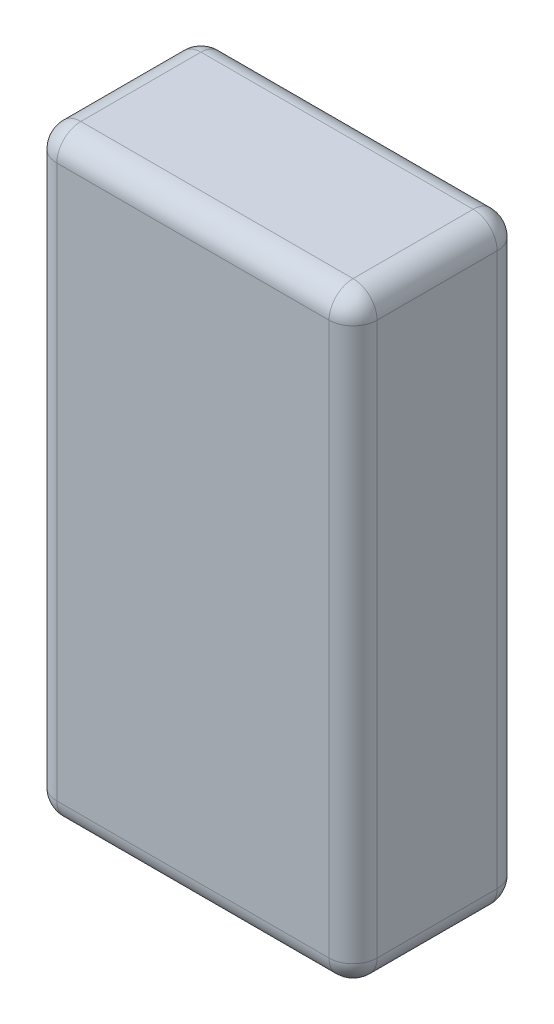
ISO-10303-21;
HEADER;
FILE_DESCRIPTION(('STEP AP214'),'2;1');
FILE_NAME('part.step','',(''),(''),'','','');
FILE_SCHEMA(('AUTOMOTIVE_DESIGN { 1 0 10303 214 1 1 1 1 }'));
ENDSEC;
DATA;
#1=APPLICATION_CONTEXT('core data for automotive mechanical design processes');
#2=APPLICATION_PROTOCOL_DEFINITION('international standard','automotive_design',2000,#1);
#3=PRODUCT_CONTEXT('',#1,'mechanical');
#4=PRODUCT('Part','Part','',(#3));
#5=PRODUCT_RELATED_PRODUCT_CATEGORY('part','',(#4));
#6=PRODUCT_DEFINITION_FORMATION('','',#4);
#7=PRODUCT_DEFINITION_CONTEXT('part definition',#1,'design');
#8=PRODUCT_DEFINITION('design','',#6,#7);
#9=PRODUCT_DEFINITION_SHAPE('','',#8);
#10=(LENGTH_UNIT() NAMED_UNIT(*) SI_UNIT(.MILLI.,.METRE.));
#11=(NAMED_UNIT(*) PLANE_ANGLE_UNIT() SI_UNIT($,.RADIAN.));
#12=(NAMED_UNIT(*) SI_UNIT($,.STERADIAN.) SOLID_ANGLE_UNIT());
#13=UNCERTAINTY_MEASURE_WITH_UNIT(LENGTH_MEASURE(1.E-05),#10,'distance_accuracy_value','');
#14=(GEOMETRIC_REPRESENTATION_CONTEXT(3) GLOBAL_UNCERTAINTY_ASSIGNED_CONTEXT((#13)) GLOBAL_UNIT_ASSIGNED_CONTEXT((#10,
#11,#12)) REPRESENTATION_CONTEXT('',''));
#15=CARTESIAN_POINT('',(0.,0.,0.));
#16=DIRECTION('',(0.,0.,1.));
#17=DIRECTION('',(1.,0.,0.));
#18=AXIS2_PLACEMENT_3D('',#15,#16,#17);
#19=CARTESIAN_POINT('',(20.,-37.5,21.));
#20=DIRECTION('',(-1.,0.,0.));
#21=DIRECTION('',(0.,0.,1.));
#22=AXIS2_PLACEMENT_3D('',#19,#20,#21);
#23=PLANE('',#22);
#24=DIRECTION('',(0.,0.,-1.));
#25=VECTOR('',#24,1.);
#26=CARTESIAN_POINT('',(20.,34.5,21.));
#27=LINE('',#26,#25);
#28=CARTESIAN_POINT('',(20.,34.5,3.));
#29=VERTEX_POINT('',#28);
#30=CARTESIAN_POINT('',(20.,34.5,18.));
#31=VERTEX_POINT('',#30);
#32=EDGE_CURVE('E199',#29,#31,#27,.F.);
#33=ORIENTED_EDGE('',*,*,#32,.T.);
#34=DIRECTION('',(0.,1.,0.));
#35=VECTOR('',#34,1.);
#36=CARTESIAN_POINT('',(20.,-37.5,18.));
#37=LINE('',#36,#35);
#38=CARTESIAN_POINT('',(20.,-34.5,18.));
#39=VERTEX_POINT('',#38);
#40=EDGE_CURVE('E206',#31,#39,#37,.F.);
#41=ORIENTED_EDGE('',*,*,#40,.T.);
#42=DIRECTION('',(0.,0.,-1.));
#43=VECTOR('',#42,1.);
#44=CARTESIAN_POINT('',(20.,-34.5,21.));
#45=LINE('',#44,#43);
#46=CARTESIAN_POINT('',(20.,-34.5,3.));
#47=VERTEX_POINT('',#46);
#48=EDGE_CURVE('E202',#39,#47,#45,.T.);
#49=ORIENTED_EDGE('',*,*,#48,.T.);
#50=DIRECTION('',(0.,1.,0.));
#51=VECTOR('',#50,1.);
#52=CARTESIAN_POINT('',(20.,37.5,3.));
#53=LINE('',#52,#51);
#54=EDGE_CURVE('E196',#47,#29,#53,.T.);
#55=ORIENTED_EDGE('',*,*,#54,.T.);
#56=EDGE_LOOP('',(#33,#41,#49,#55));
#57=FACE_BOUND('',#56,.T.);
#58=ADVANCED_FACE('F39',(#57),#23,.F.);
#59=CARTESIAN_POINT('',(-20.,37.5,21.));
#60=DIRECTION('',(0.,-1.,0.));
#61=DIRECTION('',(0.,0.,-1.));
#62=AXIS2_PLACEMENT_3D('',#59,#60,#61);
#63=PLANE('',#62);
#64=DIRECTION('',(0.,0.,-1.));
#65=VECTOR('',#64,1.);
#66=CARTESIAN_POINT('',(-17.,37.5,21.));
#67=LINE('',#66,#65);
#68=CARTESIAN_POINT('',(-17.,37.5,3.));
#69=VERTEX_POINT('',#68);
#70=CARTESIAN_POINT('',(-17.,37.5,18.));
#71=VERTEX_POINT('',#70);
#72=EDGE_CURVE('E189',#69,#71,#67,.F.);
#73=ORIENTED_EDGE('',*,*,#72,.T.);
#74=DIRECTION('',(-1.,0.,0.));
#75=VECTOR('',#74,1.);
#76=CARTESIAN_POINT('',(-20.,37.5,18.));
#77=LINE('',#76,#75);
#78=CARTESIAN_POINT('',(17.,37.5,18.));
#79=VERTEX_POINT('',#78);
#80=EDGE_CURVE('E193',#71,#79,#77,.F.);
#81=ORIENTED_EDGE('',*,*,#80,.T.);
#82=DIRECTION('',(0.,0.,-1.));
#83=VECTOR('',#82,1.);
#84=CARTESIAN_POINT('',(17.,37.5,21.));
#85=LINE('',#84,#83);
#86=CARTESIAN_POINT('',(17.,37.5,3.));
#87=VERTEX_POINT('',#86);
#88=EDGE_CURVE('E186',#79,#87,#85,.T.);
#89=ORIENTED_EDGE('',*,*,#88,.T.);
#90=DIRECTION('',(-1.,0.,0.));
#91=VECTOR('',#90,1.);
#92=CARTESIAN_POINT('',(-20.,37.5,3.));
#93=LINE('',#92,#91);
#94=EDGE_CURVE('E183',#87,#69,#93,.T.);
#95=ORIENTED_EDGE('',*,*,#94,.T.);
#96=EDGE_LOOP('',(#73,#81,#89,#95));
#97=FACE_BOUND('',#96,.T.);
#98=ADVANCED_FACE('F349',(#97),#63,.F.);
#99=CARTESIAN_POINT('',(-20.,-37.5,21.));
#100=DIRECTION('',(1.,0.,0.));
#101=DIRECTION('',(0.,0.,-1.));
#102=AXIS2_PLACEMENT_3D('',#99,#100,#101);
#103=PLANE('',#102);
#104=DIRECTION('',(0.,0.,-1.));
#105=VECTOR('',#104,1.);
#106=CARTESIAN_POINT('',(-20.,-34.5,21.));
#107=LINE('',#106,#105);
#108=CARTESIAN_POINT('',(-20.,-34.5,3.));
#109=VERTEX_POINT('',#108);
#110=CARTESIAN_POINT('',(-20.,-34.5,18.));
#111=VERTEX_POINT('',#110);
#112=EDGE_CURVE('E135',#109,#111,#107,.F.);
#113=ORIENTED_EDGE('',*,*,#112,.T.);
#114=DIRECTION('',(0.,-1.,0.));
#115=VECTOR('',#114,1.);
#116=CARTESIAN_POINT('',(-20.,-37.5,18.));
#117=LINE('',#116,#115);
#118=CARTESIAN_POINT('',(-20.,34.5,18.));
#119=VERTEX_POINT('',#118);
#120=EDGE_CURVE('E180',#111,#119,#117,.F.);
#121=ORIENTED_EDGE('',*,*,#120,.T.);
#122=DIRECTION('',(0.,0.,-1.));
#123=VECTOR('',#122,1.);
#124=CARTESIAN_POINT('',(-20.,34.5,21.));
#125=LINE('',#124,#123);
#126=CARTESIAN_POINT('',(-20.,34.5,3.));
#127=VERTEX_POINT('',#126);
#128=EDGE_CURVE('E175',#119,#127,#125,.T.);
#129=ORIENTED_EDGE('',*,*,#128,.T.);
#130=DIRECTION('',(0.,-1.,0.));
#131=VECTOR('',#130,1.);
#132=CARTESIAN_POINT('',(-20.,-37.5,3.));
#133=LINE('',#132,#131);
#134=EDGE_CURVE('E169',#127,#109,#133,.T.);
#135=ORIENTED_EDGE('',*,*,#134,.T.);
#136=EDGE_LOOP('',(#113,#121,#129,#135));
#137=FACE_BOUND('',#136,.T.);
#138=ADVANCED_FACE('F384',(#137),#103,.F.);
#139=CARTESIAN_POINT('',(-20.,-37.5,21.));
#140=DIRECTION('',(0.,1.,0.));
#141=DIRECTION('',(0.,0.,1.));
#142=AXIS2_PLACEMENT_3D('',#139,#140,#141);
#143=PLANE('',#142);
#144=DIRECTION('',(0.,0.,-1.));
#145=VECTOR('',#144,1.);
#146=CARTESIAN_POINT('',(17.,-37.5,21.));
#147=LINE('',#146,#145);
#148=CARTESIAN_POINT('',(17.,-37.5,3.));
#149=VERTEX_POINT('',#148);
#150=CARTESIAN_POINT('',(17.,-37.5,18.));
#151=VERTEX_POINT('',#150);
#152=EDGE_CURVE('E159',#149,#151,#147,.F.);
#153=ORIENTED_EDGE('',*,*,#152,.T.);
#154=DIRECTION('',(1.,0.,0.));
#155=VECTOR('',#154,1.);
#156=CARTESIAN_POINT('',(-20.,-37.5,18.));
#157=LINE('',#156,#155);
#158=CARTESIAN_POINT('',(-17.,-37.5,18.));
#159=VERTEX_POINT('',#158);
#160=EDGE_CURVE('E163',#151,#159,#157,.F.);
#161=ORIENTED_EDGE('',*,*,#160,.T.);
#162=DIRECTION('',(0.,0.,-1.));
#163=VECTOR('',#162,1.);
#164=CARTESIAN_POINT('',(-17.,-37.5,21.));
#165=LINE('',#164,#163);
#166=CARTESIAN_POINT('',(-17.,-37.5,3.));
#167=VERTEX_POINT('',#166);
#168=EDGE_CURVE('E133',#159,#167,#165,.T.);
#169=ORIENTED_EDGE('',*,*,#168,.T.);
#170=DIRECTION('',(1.,0.,0.));
#171=VECTOR('',#170,1.);
#172=CARTESIAN_POINT('',(20.,-37.5,3.));
#173=LINE('',#172,#171);
#174=EDGE_CURVE('E152',#167,#149,#173,.T.);
#175=ORIENTED_EDGE('',*,*,#174,.T.);
#176=EDGE_LOOP('',(#153,#161,#169,#175));
#177=FACE_BOUND('',#176,.T.);
#178=ADVANCED_FACE('F161',(#177),#143,.F.);
#179=CARTESIAN_POINT('',(0.,0.,21.));
#180=DIRECTION('',(0.,0.,-1.));
#181=DIRECTION('',(-1.,0.,0.));
#182=AXIS2_PLACEMENT_3D('',#179,#180,#181);
#183=PLANE('',#182);
#184=DIRECTION('',(0.,-1.,0.));
#185=VECTOR('',#184,1.);
#186=CARTESIAN_POINT('',(-17.,0.,21.));
#187=LINE('',#186,#185);
#188=CARTESIAN_POINT('',(-17.,34.5,21.));
#189=VERTEX_POINT('',#188);
#190=CARTESIAN_POINT('',(-17.,-34.5,21.));
#191=VERTEX_POINT('',#190);
#192=EDGE_CURVE('E215',#189,#191,#187,.T.);
#193=ORIENTED_EDGE('',*,*,#192,.T.);
#194=DIRECTION('',(1.,0.,0.));
#195=VECTOR('',#194,1.);
#196=CARTESIAN_POINT('',(0.,-34.5,21.));
#197=LINE('',#196,#195);
#198=CARTESIAN_POINT('',(17.,-34.5,21.));
#199=VERTEX_POINT('',#198);
#200=EDGE_CURVE('E218',#191,#199,#197,.T.);
#201=ORIENTED_EDGE('',*,*,#200,.T.);
#202=DIRECTION('',(0.,1.,0.));
#203=VECTOR('',#202,1.);
#204=CARTESIAN_POINT('',(17.,0.,21.));
#205=LINE('',#204,#203);
#206=CARTESIAN_POINT('',(17.,34.5,21.));
#207=VERTEX_POINT('',#206);
#208=EDGE_CURVE('E209',#199,#207,#205,.T.);
#209=ORIENTED_EDGE('',*,*,#208,.T.);
#210=DIRECTION('',(-1.,0.,0.));
#211=VECTOR('',#210,1.);
#212=CARTESIAN_POINT('',(0.,34.5,21.));
#213=LINE('',#212,#211);
#214=EDGE_CURVE('E212',#207,#189,#213,.T.);
#215=ORIENTED_EDGE('',*,*,#214,.T.);
#216=EDGE_LOOP('',(#193,#201,#209,#215));
#217=FACE_BOUND('',#216,.T.);
#218=ADVANCED_FACE('F323',(#217),#183,.F.);
#219=CARTESIAN_POINT('',(0.,0.,0.));
#220=DIRECTION('',(0.,0.,-1.));
#221=DIRECTION('',(-1.,0.,0.));
#222=AXIS2_PLACEMENT_3D('',#219,#220,#221);
#223=PLANE('',#222);
#224=DIRECTION('',(0.,-1.,0.));
#225=VECTOR('',#224,1.);
#226=CARTESIAN_POINT('',(-17.,37.5,0.));
#227=LINE('',#226,#225);
#228=CARTESIAN_POINT('',(-17.,-34.5,0.));
#229=VERTEX_POINT('',#228);
#230=CARTESIAN_POINT('',(-17.,34.5,0.));
#231=VERTEX_POINT('',#230);
#232=EDGE_CURVE('E49',#229,#231,#227,.F.);
#233=ORIENTED_EDGE('',*,*,#232,.T.);
#234=DIRECTION('',(-1.,0.,0.));
#235=VECTOR('',#234,1.);
#236=CARTESIAN_POINT('',(20.,34.5,0.));
#237=LINE('',#236,#235);
#238=CARTESIAN_POINT('',(17.,34.5,0.));
#239=VERTEX_POINT('',#238);
#240=EDGE_CURVE('E11',#231,#239,#237,.F.);
#241=ORIENTED_EDGE('',*,*,#240,.T.);
#242=DIRECTION('',(0.,1.,0.));
#243=VECTOR('',#242,1.);
#244=CARTESIAN_POINT('',(17.,-37.5,0.));
#245=LINE('',#244,#243);
#246=CARTESIAN_POINT('',(17.,-34.5,0.));
#247=VERTEX_POINT('',#246);
#248=EDGE_CURVE('E222',#239,#247,#245,.F.);
#249=ORIENTED_EDGE('',*,*,#248,.T.);
#250=DIRECTION('',(1.,0.,0.));
#251=VECTOR('',#250,1.);
#252=CARTESIAN_POINT('',(-20.,-34.5,0.));
#253=LINE('',#252,#251);
#254=EDGE_CURVE('E60',#247,#229,#253,.F.);
#255=ORIENTED_EDGE('',*,*,#254,.T.);
#256=EDGE_LOOP('',(#233,#241,#249,#255));
#257=FACE_BOUND('',#256,.T.);
#258=ADVANCED_FACE('F416',(#257),#223,.T.);
#259=CARTESIAN_POINT('',(17.,34.5,21.));
#260=DIRECTION('',(0.,0.,-1.));
#261=DIRECTION('',(-1.,0.,0.));
#262=AXIS2_PLACEMENT_3D('',#259,#260,#261);
#263=CYLINDRICAL_SURFACE('',#262,3.);
#264=CARTESIAN_POINT('',(17.,34.5,18.));
#265=DIRECTION('',(0.,0.,1.));
#266=DIRECTION('',(1.,0.,0.));
#267=AXIS2_PLACEMENT_3D('',#264,#265,#266);
#268=CIRCLE('',#267,3.);
#269=EDGE_CURVE('E43',#31,#79,#268,.T.);
#270=ORIENTED_EDGE('',*,*,#269,.F.);
#271=ORIENTED_EDGE('',*,*,#32,.F.);
#272=CARTESIAN_POINT('',(17.,34.5,3.));
#273=DIRECTION('',(0.,0.,-1.));
#274=DIRECTION('',(-1.,0.,0.));
#275=AXIS2_PLACEMENT_3D('',#272,#273,#274);
#276=CIRCLE('',#275,3.);
#277=EDGE_CURVE('E298',#87,#29,#276,.T.);
#278=ORIENTED_EDGE('',*,*,#277,.F.);
#279=ORIENTED_EDGE('',*,*,#88,.F.);
#280=EDGE_LOOP('',(#270,#271,#278,#279));
#281=FACE_BOUND('',#280,.T.);
#282=ADVANCED_FACE('F41',(#281),#263,.T.);
#283=CARTESIAN_POINT('',(17.,34.5,18.));
#284=DIRECTION('',(0.,1.,0.));
#285=DIRECTION('',(-1.,0.,0.));
#286=AXIS2_PLACEMENT_3D('',#283,#284,#285);
#287=SPHERICAL_SURFACE('',#286,3.);
#288=CARTESIAN_POINT('',(17.,34.5,18.));
#289=DIRECTION('',(0.,1.,0.));
#290=DIRECTION('',(0.,0.,1.));
#291=AXIS2_PLACEMENT_3D('',#288,#289,#290);
#292=CIRCLE('',#291,3.);
#293=EDGE_CURVE('E291',#31,#207,#292,.F.);
#294=ORIENTED_EDGE('',*,*,#293,.F.);
#295=ORIENTED_EDGE('',*,*,#269,.T.);
#296=CARTESIAN_POINT('',(17.,34.5,18.));
#297=DIRECTION('',(1.,0.,0.));
#298=DIRECTION('',(0.,0.,-1.));
#299=AXIS2_PLACEMENT_3D('',#296,#297,#298);
#300=CIRCLE('',#299,3.);
#301=EDGE_CURVE('E295',#207,#79,#300,.F.);
#302=ORIENTED_EDGE('',*,*,#301,.F.);
#303=EDGE_LOOP('',(#294,#295,#302));
#304=FACE_BOUND('',#303,.T.);
#305=ADVANCED_FACE('F311',(#304),#287,.T.);
#306=CARTESIAN_POINT('',(17.,34.5,3.));
#307=DIRECTION('',(1.,0.,0.));
#308=DIRECTION('',(0.,0.,-1.));
#309=AXIS2_PLACEMENT_3D('',#306,#307,#308);
#310=SPHERICAL_SURFACE('',#309,3.);
#311=CARTESIAN_POINT('',(17.,34.5,3.));
#312=DIRECTION('',(1.,0.,0.));
#313=DIRECTION('',(0.,1.,0.));
#314=AXIS2_PLACEMENT_3D('',#311,#312,#313);
#315=CIRCLE('',#314,3.);
#316=EDGE_CURVE('E283',#87,#239,#315,.F.);
#317=ORIENTED_EDGE('',*,*,#316,.F.);
#318=ORIENTED_EDGE('',*,*,#277,.T.);
#319=CARTESIAN_POINT('',(17.,34.5,3.));
#320=DIRECTION('',(0.,1.,0.));
#321=DIRECTION('',(0.,0.,1.));
#322=AXIS2_PLACEMENT_3D('',#319,#320,#321);
#323=CIRCLE('',#322,3.);
#324=EDGE_CURVE('E287',#239,#29,#323,.F.);
#325=ORIENTED_EDGE('',*,*,#324,.F.);
#326=EDGE_LOOP('',(#317,#318,#325));
#327=FACE_BOUND('',#326,.T.);
#328=ADVANCED_FACE('F343',(#327),#310,.T.);
#329=CARTESIAN_POINT('',(0.,34.5,18.));
#330=DIRECTION('',(-1.,0.,0.));
#331=DIRECTION('',(0.,0.,1.));
#332=AXIS2_PLACEMENT_3D('',#329,#330,#331);
#333=CYLINDRICAL_SURFACE('',#332,3.);
#334=ORIENTED_EDGE('',*,*,#301,.T.);
#335=ORIENTED_EDGE('',*,*,#80,.F.);
#336=CARTESIAN_POINT('',(-17.,34.5,18.));
#337=DIRECTION('',(-1.,0.,0.));
#338=DIRECTION('',(0.,0.,1.));
#339=AXIS2_PLACEMENT_3D('',#336,#337,#338);
#340=CIRCLE('',#339,3.);
#341=EDGE_CURVE('E276',#189,#71,#340,.T.);
#342=ORIENTED_EDGE('',*,*,#341,.F.);
#343=ORIENTED_EDGE('',*,*,#214,.F.);
#344=EDGE_LOOP('',(#334,#335,#342,#343));
#345=FACE_BOUND('',#344,.T.);
#346=ADVANCED_FACE('F319',(#345),#333,.T.);
#347=CARTESIAN_POINT('',(17.,0.,18.));
#348=DIRECTION('',(0.,1.,0.));
#349=DIRECTION('',(0.,0.,1.));
#350=AXIS2_PLACEMENT_3D('',#347,#348,#349);
#351=CYLINDRICAL_SURFACE('',#350,3.);
#352=ORIENTED_EDGE('',*,*,#293,.T.);
#353=ORIENTED_EDGE('',*,*,#208,.F.);
#354=CARTESIAN_POINT('',(17.,-34.5,18.));
#355=DIRECTION('',(0.,-1.,0.));
#356=DIRECTION('',(0.,0.,-1.));
#357=AXIS2_PLACEMENT_3D('',#354,#355,#356);
#358=CIRCLE('',#357,3.);
#359=EDGE_CURVE('E272',#39,#199,#358,.T.);
#360=ORIENTED_EDGE('',*,*,#359,.F.);
#361=ORIENTED_EDGE('',*,*,#40,.F.);
#362=EDGE_LOOP('',(#352,#353,#360,#361));
#363=FACE_BOUND('',#362,.T.);
#364=ADVANCED_FACE('F329',(#363),#351,.T.);
#365=CARTESIAN_POINT('',(17.,-34.5,21.));
#366=DIRECTION('',(0.,0.,-1.));
#367=DIRECTION('',(-1.,0.,0.));
#368=AXIS2_PLACEMENT_3D('',#365,#366,#367);
#369=CYLINDRICAL_SURFACE('',#368,3.);
#370=CARTESIAN_POINT('',(17.,-34.5,3.));
#371=DIRECTION('',(0.,0.,-1.));
#372=DIRECTION('',(-1.,0.,0.));
#373=AXIS2_PLACEMENT_3D('',#370,#371,#372);
#374=CIRCLE('',#373,3.);
#375=EDGE_CURVE('E264',#47,#149,#374,.T.);
#376=ORIENTED_EDGE('',*,*,#375,.F.);
#377=ORIENTED_EDGE('',*,*,#48,.F.);
#378=CARTESIAN_POINT('',(17.,-34.5,18.));
#379=DIRECTION('',(0.,0.,1.));
#380=DIRECTION('',(1.,0.,0.));
#381=AXIS2_PLACEMENT_3D('',#378,#379,#380);
#382=CIRCLE('',#381,3.);
#383=EDGE_CURVE('E268',#151,#39,#382,.T.);
#384=ORIENTED_EDGE('',*,*,#383,.F.);
#385=ORIENTED_EDGE('',*,*,#152,.F.);
#386=EDGE_LOOP('',(#376,#377,#384,#385));
#387=FACE_BOUND('',#386,.T.);
#388=ADVANCED_FACE('F335',(#387),#369,.T.);
#389=CARTESIAN_POINT('',(17.,-37.5,3.));
#390=DIRECTION('',(0.,-1.,0.));
#391=DIRECTION('',(0.,0.,-1.));
#392=AXIS2_PLACEMENT_3D('',#389,#390,#391);
#393=CYLINDRICAL_SURFACE('',#392,3.);
#394=ORIENTED_EDGE('',*,*,#324,.T.);
#395=ORIENTED_EDGE('',*,*,#54,.F.);
#396=CARTESIAN_POINT('',(17.,-34.5,3.));
#397=DIRECTION('',(0.,-1.,0.));
#398=DIRECTION('',(0.,0.,-1.));
#399=AXIS2_PLACEMENT_3D('',#396,#397,#398);
#400=CIRCLE('',#399,3.);
#401=EDGE_CURVE('E261',#247,#47,#400,.T.);
#402=ORIENTED_EDGE('',*,*,#401,.F.);
#403=ORIENTED_EDGE('',*,*,#248,.F.);
#404=EDGE_LOOP('',(#394,#395,#402,#403));
#405=FACE_BOUND('',#404,.T.);
#406=ADVANCED_FACE('F341',(#405),#393,.T.);
#407=CARTESIAN_POINT('',(-20.,34.5,3.));
#408=DIRECTION('',(1.,0.,0.));
#409=DIRECTION('',(0.,0.,-1.));
#410=AXIS2_PLACEMENT_3D('',#407,#408,#409);
#411=CYLINDRICAL_SURFACE('',#410,3.);
#412=ORIENTED_EDGE('',*,*,#316,.T.);
#413=ORIENTED_EDGE('',*,*,#240,.F.);
#414=CARTESIAN_POINT('',(-17.,34.5,3.));
#415=DIRECTION('',(-1.,0.,0.));
#416=DIRECTION('',(0.,0.,1.));
#417=AXIS2_PLACEMENT_3D('',#414,#415,#416);
#418=CIRCLE('',#417,3.);
#419=EDGE_CURVE('E257',#69,#231,#418,.T.);
#420=ORIENTED_EDGE('',*,*,#419,.F.);
#421=ORIENTED_EDGE('',*,*,#94,.F.);
#422=EDGE_LOOP('',(#412,#413,#420,#421));
#423=FACE_BOUND('',#422,.T.);
#424=ADVANCED_FACE('F346',(#423),#411,.T.);
#425=CARTESIAN_POINT('',(-17.,34.5,21.));
#426=DIRECTION('',(0.,0.,-1.));
#427=DIRECTION('',(-1.,0.,0.));
#428=AXIS2_PLACEMENT_3D('',#425,#426,#427);
#429=CYLINDRICAL_SURFACE('',#428,3.);
#430=CARTESIAN_POINT('',(-17.,34.5,18.));
#431=DIRECTION('',(0.,0.,1.));
#432=DIRECTION('',(1.,0.,0.));
#433=AXIS2_PLACEMENT_3D('',#430,#431,#432);
#434=CIRCLE('',#433,3.);
#435=EDGE_CURVE('E279',#71,#119,#434,.T.);
#436=ORIENTED_EDGE('',*,*,#435,.F.);
#437=ORIENTED_EDGE('',*,*,#72,.F.);
#438=CARTESIAN_POINT('',(-17.,34.5,3.));
#439=DIRECTION('',(0.,0.,-1.));
#440=DIRECTION('',(-1.,0.,0.));
#441=AXIS2_PLACEMENT_3D('',#438,#439,#440);
#442=CIRCLE('',#441,3.);
#443=EDGE_CURVE('E253',#127,#69,#442,.T.);
#444=ORIENTED_EDGE('',*,*,#443,.F.);
#445=ORIENTED_EDGE('',*,*,#128,.F.);
#446=EDGE_LOOP('',(#436,#437,#444,#445));
#447=FACE_BOUND('',#446,.T.);
#448=ADVANCED_FACE('F353',(#447),#429,.T.);
#449=CARTESIAN_POINT('',(-17.,34.5,18.));
#450=DIRECTION('',(0.,1.,0.));
#451=DIRECTION('',(0.,0.,1.));
#452=AXIS2_PLACEMENT_3D('',#449,#450,#451);
#453=SPHERICAL_SURFACE('',#452,3.);
#454=ORIENTED_EDGE('',*,*,#341,.T.);
#455=ORIENTED_EDGE('',*,*,#435,.T.);
#456=CARTESIAN_POINT('',(-17.,34.5,18.));
#457=DIRECTION('',(0.,1.,0.));
#458=DIRECTION('',(0.,0.,1.));
#459=AXIS2_PLACEMENT_3D('',#456,#457,#458);
#460=CIRCLE('',#459,3.);
#461=EDGE_CURVE('E249',#189,#119,#460,.F.);
#462=ORIENTED_EDGE('',*,*,#461,.F.);
#463=EDGE_LOOP('',(#454,#455,#462));
#464=FACE_BOUND('',#463,.T.);
#465=ADVANCED_FACE('F357',(#464),#453,.T.);
#466=CARTESIAN_POINT('',(17.,-34.5,18.));
#467=DIRECTION('',(1.,0.,0.));
#468=DIRECTION('',(0.,0.,-1.));
#469=AXIS2_PLACEMENT_3D('',#466,#467,#468);
#470=SPHERICAL_SURFACE('',#469,3.);
#471=ORIENTED_EDGE('',*,*,#383,.T.);
#472=ORIENTED_EDGE('',*,*,#359,.T.);
#473=CARTESIAN_POINT('',(17.,-34.5,18.));
#474=DIRECTION('',(1.,0.,0.));
#475=DIRECTION('',(0.,0.,-1.));
#476=AXIS2_PLACEMENT_3D('',#473,#474,#475);
#477=CIRCLE('',#476,3.);
#478=EDGE_CURVE('E246',#151,#199,#477,.F.);
#479=ORIENTED_EDGE('',*,*,#478,.F.);
#480=EDGE_LOOP('',(#471,#472,#479));
#481=FACE_BOUND('',#480,.T.);
#482=ADVANCED_FACE('F368',(#481),#470,.T.);
#483=CARTESIAN_POINT('',(17.,-34.5,3.));
#484=DIRECTION('',(1.,0.,0.));
#485=DIRECTION('',(0.,0.,-1.));
#486=AXIS2_PLACEMENT_3D('',#483,#484,#485);
#487=SPHERICAL_SURFACE('',#486,3.);
#488=ORIENTED_EDGE('',*,*,#401,.T.);
#489=ORIENTED_EDGE('',*,*,#375,.T.);
#490=CARTESIAN_POINT('',(17.,-34.5,3.));
#491=DIRECTION('',(1.,0.,0.));
#492=DIRECTION('',(0.,0.,-1.));
#493=AXIS2_PLACEMENT_3D('',#490,#491,#492);
#494=CIRCLE('',#493,3.);
#495=EDGE_CURVE('E155',#247,#149,#494,.F.);
#496=ORIENTED_EDGE('',*,*,#495,.F.);
#497=EDGE_LOOP('',(#488,#489,#496));
#498=FACE_BOUND('',#497,.T.);
#499=ADVANCED_FACE('F370',(#498),#487,.T.);
#500=CARTESIAN_POINT('',(-17.,34.5,3.));
#501=DIRECTION('',(0.,1.,0.));
#502=DIRECTION('',(0.,0.,1.));
#503=AXIS2_PLACEMENT_3D('',#500,#501,#502);
#504=SPHERICAL_SURFACE('',#503,3.);
#505=ORIENTED_EDGE('',*,*,#443,.T.);
#506=ORIENTED_EDGE('',*,*,#419,.T.);
#507=CARTESIAN_POINT('',(-17.,34.5,3.));
#508=DIRECTION('',(0.,1.,0.));
#509=DIRECTION('',(-1.,0.,0.));
#510=AXIS2_PLACEMENT_3D('',#507,#508,#509);
#511=CIRCLE('',#510,3.);
#512=EDGE_CURVE('E240',#127,#231,#511,.F.);
#513=ORIENTED_EDGE('',*,*,#512,.F.);
#514=EDGE_LOOP('',(#505,#506,#513));
#515=FACE_BOUND('',#514,.T.);
#516=ADVANCED_FACE('F376',(#515),#504,.T.);
#517=CARTESIAN_POINT('',(-17.,0.,18.));
#518=DIRECTION('',(0.,-1.,0.));
#519=DIRECTION('',(0.,0.,-1.));
#520=AXIS2_PLACEMENT_3D('',#517,#518,#519);
#521=CYLINDRICAL_SURFACE('',#520,3.);
#522=ORIENTED_EDGE('',*,*,#461,.T.);
#523=ORIENTED_EDGE('',*,*,#120,.F.);
#524=CARTESIAN_POINT('',(-17.,-34.5,18.));
#525=DIRECTION('',(0.,-1.,0.));
#526=DIRECTION('',(0.,0.,-1.));
#527=AXIS2_PLACEMENT_3D('',#524,#525,#526);
#528=CIRCLE('',#527,3.);
#529=EDGE_CURVE('E236',#191,#111,#528,.T.);
#530=ORIENTED_EDGE('',*,*,#529,.F.);
#531=ORIENTED_EDGE('',*,*,#192,.F.);
#532=EDGE_LOOP('',(#522,#523,#530,#531));
#533=FACE_BOUND('',#532,.T.);
#534=ADVANCED_FACE('F360',(#533),#521,.T.);
#535=CARTESIAN_POINT('',(0.,-34.5,18.));
#536=DIRECTION('',(1.,0.,0.));
#537=DIRECTION('',(0.,0.,-1.));
#538=AXIS2_PLACEMENT_3D('',#535,#536,#537);
#539=CYLINDRICAL_SURFACE('',#538,3.);
#540=ORIENTED_EDGE('',*,*,#478,.T.);
#541=ORIENTED_EDGE('',*,*,#200,.F.);
#542=CARTESIAN_POINT('',(-17.,-34.5,18.));
#543=DIRECTION('',(-1.,0.,0.));
#544=DIRECTION('',(0.,0.,1.));
#545=AXIS2_PLACEMENT_3D('',#542,#543,#544);
#546=CIRCLE('',#545,3.);
#547=EDGE_CURVE('E149',#159,#191,#546,.T.);
#548=ORIENTED_EDGE('',*,*,#547,.F.);
#549=ORIENTED_EDGE('',*,*,#160,.F.);
#550=EDGE_LOOP('',(#540,#541,#548,#549));
#551=FACE_BOUND('',#550,.T.);
#552=ADVANCED_FACE('F366',(#551),#539,.T.);
#553=CARTESIAN_POINT('',(-20.,-34.5,3.));
#554=DIRECTION('',(-1.,0.,0.));
#555=DIRECTION('',(0.,0.,1.));
#556=AXIS2_PLACEMENT_3D('',#553,#554,#555);
#557=CYLINDRICAL_SURFACE('',#556,3.);
#558=ORIENTED_EDGE('',*,*,#495,.T.);
#559=ORIENTED_EDGE('',*,*,#174,.F.);
#560=CARTESIAN_POINT('',(-17.,-34.5,3.));
#561=DIRECTION('',(-1.,0.,0.));
#562=DIRECTION('',(0.,0.,1.));
#563=AXIS2_PLACEMENT_3D('',#560,#561,#562);
#564=CIRCLE('',#563,3.);
#565=EDGE_CURVE('E142',#229,#167,#564,.T.);
#566=ORIENTED_EDGE('',*,*,#565,.F.);
#567=ORIENTED_EDGE('',*,*,#254,.F.);
#568=EDGE_LOOP('',(#558,#559,#566,#567));
#569=FACE_BOUND('',#568,.T.);
#570=ADVANCED_FACE('F153',(#569),#557,.T.);
#571=CARTESIAN_POINT('',(-17.,-37.5,3.));
#572=DIRECTION('',(0.,1.,0.));
#573=DIRECTION('',(0.,0.,1.));
#574=AXIS2_PLACEMENT_3D('',#571,#572,#573);
#575=CYLINDRICAL_SURFACE('',#574,3.);
#576=ORIENTED_EDGE('',*,*,#512,.T.);
#577=ORIENTED_EDGE('',*,*,#232,.F.);
#578=CARTESIAN_POINT('',(-17.,-34.5,3.));
#579=DIRECTION('',(0.,-1.,0.));
#580=DIRECTION('',(0.,0.,-1.));
#581=AXIS2_PLACEMENT_3D('',#578,#579,#580);
#582=CIRCLE('',#581,3.);
#583=EDGE_CURVE('E146',#109,#229,#582,.T.);
#584=ORIENTED_EDGE('',*,*,#583,.F.);
#585=ORIENTED_EDGE('',*,*,#134,.F.);
#586=EDGE_LOOP('',(#576,#577,#584,#585));
#587=FACE_BOUND('',#586,.T.);
#588=ADVANCED_FACE('F394',(#587),#575,.T.);
#589=CARTESIAN_POINT('',(-17.,-34.5,18.));
#590=DIRECTION('',(0.,0.,1.));
#591=DIRECTION('',(1.,0.,0.));
#592=AXIS2_PLACEMENT_3D('',#589,#590,#591);
#593=SPHERICAL_SURFACE('',#592,3.);
#594=ORIENTED_EDGE('',*,*,#547,.T.);
#595=ORIENTED_EDGE('',*,*,#529,.T.);
#596=CARTESIAN_POINT('',(-17.,-34.5,18.));
#597=DIRECTION('',(0.,0.,1.));
#598=DIRECTION('',(1.,0.,0.));
#599=AXIS2_PLACEMENT_3D('',#596,#597,#598);
#600=CIRCLE('',#599,3.);
#601=EDGE_CURVE('E139',#159,#111,#600,.F.);
#602=ORIENTED_EDGE('',*,*,#601,.F.);
#603=EDGE_LOOP('',(#594,#595,#602));
#604=FACE_BOUND('',#603,.T.);
#605=ADVANCED_FACE('F364',(#604),#593,.T.);
#606=CARTESIAN_POINT('',(-17.,-34.5,3.));
#607=DIRECTION('',(0.,0.,-1.));
#608=DIRECTION('',(-1.,0.,0.));
#609=AXIS2_PLACEMENT_3D('',#606,#607,#608);
#610=SPHERICAL_SURFACE('',#609,3.);
#611=ORIENTED_EDGE('',*,*,#583,.T.);
#612=ORIENTED_EDGE('',*,*,#565,.T.);
#613=CARTESIAN_POINT('',(-17.,-34.5,3.));
#614=DIRECTION('',(0.,0.,-1.));
#615=DIRECTION('',(-1.,0.,0.));
#616=AXIS2_PLACEMENT_3D('',#613,#614,#615);
#617=CIRCLE('',#616,3.);
#618=EDGE_CURVE('E129',#109,#167,#617,.F.);
#619=ORIENTED_EDGE('',*,*,#618,.F.);
#620=EDGE_LOOP('',(#611,#612,#619));
#621=FACE_BOUND('',#620,.T.);
#622=ADVANCED_FACE('F144',(#621),#610,.T.);
#623=CARTESIAN_POINT('',(-17.,-34.5,21.));
#624=DIRECTION('',(0.,0.,-1.));
#625=DIRECTION('',(-1.,0.,0.));
#626=AXIS2_PLACEMENT_3D('',#623,#624,#625);
#627=CYLINDRICAL_SURFACE('',#626,3.);
#628=ORIENTED_EDGE('',*,*,#601,.T.);
#629=ORIENTED_EDGE('',*,*,#112,.F.);
#630=ORIENTED_EDGE('',*,*,#618,.T.);
#631=ORIENTED_EDGE('',*,*,#168,.F.);
#632=EDGE_LOOP('',(#628,#629,#630,#631));
#633=FACE_BOUND('',#632,.T.);
#634=ADVANCED_FACE('F131',(#633),#627,.T.);
#635=CLOSED_SHELL('',(#58,#98,#138,#178,#218,#258,#282,#305,#328,#346,#364,#388,#406,#424,#448,
#465,#482,#499,#516,#534,#552,#570,#588,#605,#622,#634));
#636=MANIFOLD_SOLID_BREP('B2',#635);
#637=ADVANCED_BREP_SHAPE_REPRESENTATION('',(#18,#636),#14);
#638=SHAPE_DEFINITION_REPRESENTATION(#9,#637);
ENDSEC;
END-ISO-10303-21;
